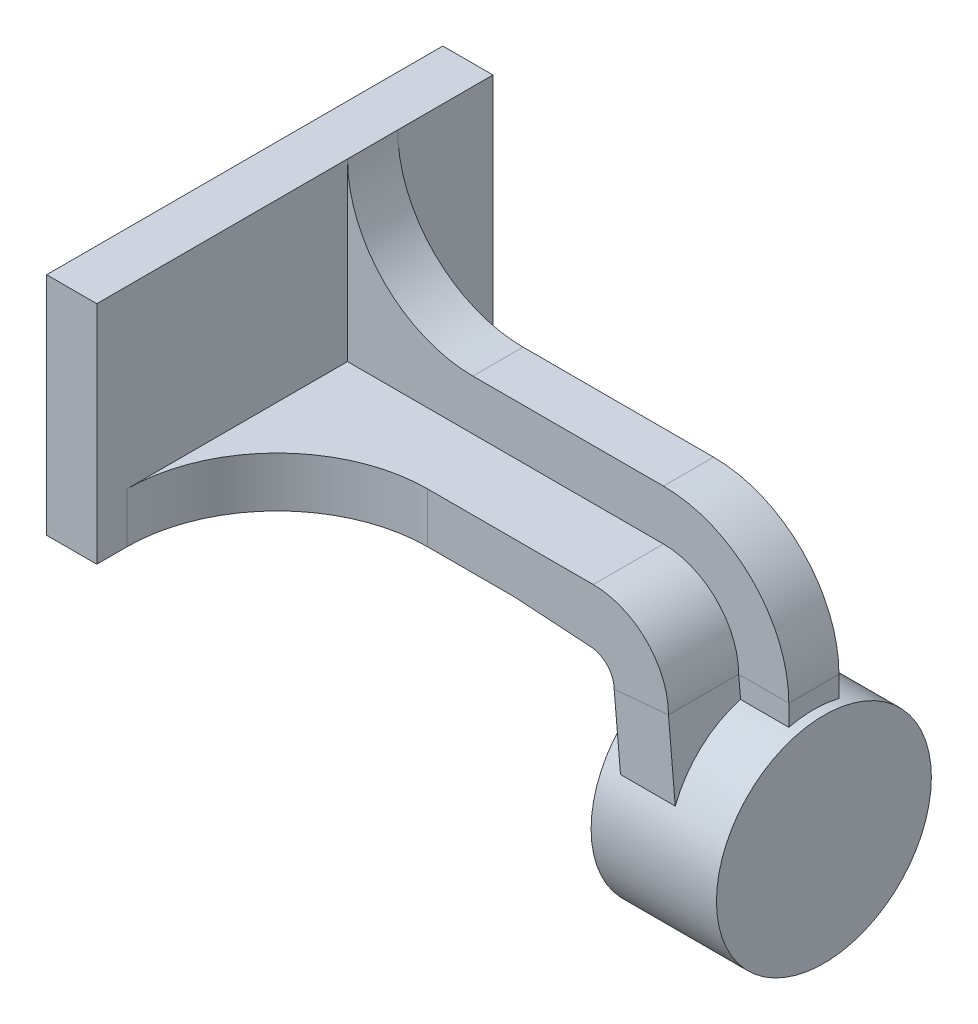
ISO-10303-21;
HEADER;
FILE_DESCRIPTION(('STEP AP214'),'2;1');
FILE_NAME('part.step','',(''),(''),'','','');
FILE_SCHEMA(('AUTOMOTIVE_DESIGN { 1 0 10303 214 1 1 1 1 }'));
ENDSEC;
DATA;
#1=APPLICATION_CONTEXT('core data for automotive mechanical design processes');
#2=APPLICATION_PROTOCOL_DEFINITION('international standard','automotive_design',2000,#1);
#3=PRODUCT_CONTEXT('',#1,'mechanical');
#4=PRODUCT('Part','Part','',(#3));
#5=PRODUCT_RELATED_PRODUCT_CATEGORY('part','',(#4));
#6=PRODUCT_DEFINITION_FORMATION('','',#4);
#7=PRODUCT_DEFINITION_CONTEXT('part definition',#1,'design');
#8=PRODUCT_DEFINITION('design','',#6,#7);
#9=PRODUCT_DEFINITION_SHAPE('','',#8);
#10=(LENGTH_UNIT() NAMED_UNIT(*) SI_UNIT(.MILLI.,.METRE.));
#11=(NAMED_UNIT(*) PLANE_ANGLE_UNIT() SI_UNIT($,.RADIAN.));
#12=(NAMED_UNIT(*) SI_UNIT($,.STERADIAN.) SOLID_ANGLE_UNIT());
#13=UNCERTAINTY_MEASURE_WITH_UNIT(LENGTH_MEASURE(1.E-05),#10,'distance_accuracy_value','');
#14=(GEOMETRIC_REPRESENTATION_CONTEXT(3) GLOBAL_UNCERTAINTY_ASSIGNED_CONTEXT((#13)) GLOBAL_UNIT_ASSIGNED_CONTEXT((#10,
#11,#12)) REPRESENTATION_CONTEXT('',''));
#15=CARTESIAN_POINT('',(0.,0.,0.));
#16=DIRECTION('',(0.,0.,1.));
#17=DIRECTION('',(1.,0.,0.));
#18=AXIS2_PLACEMENT_3D('',#15,#16,#17);
#19=CARTESIAN_POINT('',(75.,-34.9279807418266,25.1112766748221));
#20=DIRECTION('',(1.,0.,0.));
#21=DIRECTION('',(0.,0.,-1.));
#22=AXIS2_PLACEMENT_3D('',#19,#20,#21);
#23=CYLINDRICAL_SURFACE('',#22,21.4279991516626);
#24=CARTESIAN_POINT('',(75.,-34.9279807418266,25.1112766748221));
#25=DIRECTION('',(1.,0.,0.));
#26=DIRECTION('',(0.,0.,-1.));
#27=AXIS2_PLACEMENT_3D('',#24,#25,#26);
#28=CIRCLE('',#27,21.4279991516626);
#29=CARTESIAN_POINT('',(75.,-34.9279807418266,3.68327752315946));
#30=VERTEX_POINT('',#29);
#31=EDGE_CURVE('E164',#30,#30,#28,.T.);
#32=ORIENTED_EDGE('',*,*,#31,.T.);
#33=EDGE_LOOP('',(#32));
#34=FACE_BOUND('',#33,.T.);
#35=CARTESIAN_POINT('',(100.,-34.9279807418266,25.1112766748221));
#36=DIRECTION('',(1.,0.,0.));
#37=DIRECTION('',(0.,0.,-1.));
#38=AXIS2_PLACEMENT_3D('',#35,#36,#37);
#39=CIRCLE('',#38,21.4279991516626);
#40=CARTESIAN_POINT('',(100.,-34.9279807418266,3.68327752315946));
#41=VERTEX_POINT('',#40);
#42=EDGE_CURVE('E163',#41,#41,#39,.T.);
#43=ORIENTED_EDGE('',*,*,#42,.F.);
#44=EDGE_LOOP('',(#43));
#45=FACE_BOUND('',#44,.T.);
#46=CARTESIAN_POINT('',(79.3245673172224,-34.9279807418266,25.1112766748221));
#47=DIRECTION('',(0.996013829020688,0.08919894842176,0.));
#48=DIRECTION('',(0.08919894842176,-0.996013829020688,0.));
#49=AXIS2_PLACEMENT_3D('',#46,#47,#48);
#50=ELLIPSE('',#49,21.5137566641332,21.4279991516626);
#51=CARTESIAN_POINT('',(78.4372892313713,-25.0204508961156,44.1112766748221));
#52=VERTEX_POINT('',#51);
#53=CARTESIAN_POINT('',(77.4585363613101,-14.0914947702513,30.1112766748221));
#54=VERTEX_POINT('',#53);
#55=EDGE_CURVE('E12',#52,#54,#50,.F.);
#56=ORIENTED_EDGE('',*,*,#55,.T.);
#57=DIRECTION('',(1.,0.,0.));
#58=VECTOR('',#57,1.);
#59=CARTESIAN_POINT('',(75.,-14.0914947702513,30.1112766748221));
#60=LINE('',#59,#58);
#61=CARTESIAN_POINT('',(88.,-14.0914947702513,30.1112766748221));
#62=VERTEX_POINT('',#61);
#63=EDGE_CURVE('E112',#54,#62,#60,.T.);
#64=ORIENTED_EDGE('',*,*,#63,.T.);
#65=CARTESIAN_POINT('',(88.,-34.9279807418266,25.1112766748221));
#66=DIRECTION('',(1.,0.,0.));
#67=DIRECTION('',(0.,1.,0.));
#68=AXIS2_PLACEMENT_3D('',#65,#66,#67);
#69=CIRCLE('',#68,21.4279991516626);
#70=CARTESIAN_POINT('',(88.,-14.0914947702513,20.1112766748221));
#71=VERTEX_POINT('',#70);
#72=EDGE_CURVE('E178',#62,#71,#69,.F.);
#73=ORIENTED_EDGE('',*,*,#72,.T.);
#74=DIRECTION('',(1.,0.,0.));
#75=VECTOR('',#74,1.);
#76=CARTESIAN_POINT('',(75.,-14.0914947702513,20.1112766748221));
#77=LINE('',#76,#75);
#78=CARTESIAN_POINT('',(98.,-14.0914947702513,20.1112766748221));
#79=VERTEX_POINT('',#78);
#80=EDGE_CURVE('E175',#71,#79,#77,.T.);
#81=ORIENTED_EDGE('',*,*,#80,.T.);
#82=CARTESIAN_POINT('',(98.,-34.9279807418266,25.1112766748221));
#83=DIRECTION('',(-1.,0.,0.));
#84=DIRECTION('',(0.,-1.,0.));
#85=AXIS2_PLACEMENT_3D('',#82,#83,#84);
#86=CIRCLE('',#85,21.4279991516626);
#87=CARTESIAN_POINT('',(98.,-14.0914947702513,30.1112766748221));
#88=VERTEX_POINT('',#87);
#89=EDGE_CURVE('E172',#79,#88,#86,.F.);
#90=ORIENTED_EDGE('',*,*,#89,.T.);
#91=DIRECTION('',(1.,0.,0.));
#92=VECTOR('',#91,1.);
#93=CARTESIAN_POINT('',(75.,-14.0914947702513,30.1112766748221));
#94=LINE('',#93,#92);
#95=CARTESIAN_POINT('',(88.3728673862289,-14.0914947702513,30.1112766748221));
#96=VERTEX_POINT('',#95);
#97=EDGE_CURVE('E167',#88,#96,#94,.F.);
#98=ORIENTED_EDGE('',*,*,#97,.T.);
#99=CARTESIAN_POINT('',(90.2388983421411,-34.9279807418266,25.1112766748221));
#100=DIRECTION('',(-0.996013829020688,-0.08919894842176,0.));
#101=DIRECTION('',(0.08919894842176,-0.996013829020688,0.));
#102=AXIS2_PLACEMENT_3D('',#99,#100,#101);
#103=ELLIPSE('',#102,21.5137566641332,21.4279991516626);
#104=CARTESIAN_POINT('',(89.3516202562901,-25.0204508961156,44.1112766748221));
#105=VERTEX_POINT('',#104);
#106=EDGE_CURVE('E140',#96,#105,#103,.F.);
#107=ORIENTED_EDGE('',*,*,#106,.T.);
#108=DIRECTION('',(1.,0.,0.));
#109=VECTOR('',#108,1.);
#110=CARTESIAN_POINT('',(75.,-25.0204508961156,44.1112766748221));
#111=LINE('',#110,#109);
#112=EDGE_CURVE('E57',#105,#52,#111,.F.);
#113=ORIENTED_EDGE('',*,*,#112,.T.);
#114=EDGE_LOOP('',(#56,#64,#73,#81,#90,#98,#107,#113));
#115=FACE_BOUND('',#114,.T.);
#116=ADVANCED_FACE('F49',(#34,#45,#115),#23,.T.);
#117=CARTESIAN_POINT('',(88.,-20.9279807418266,30.1112766748221));
#118=DIRECTION('',(0.,0.,-1.));
#119=DIRECTION('',(-1.,0.,0.));
#120=AXIS2_PLACEMENT_3D('',#117,#118,#119);
#121=PLANE('',#120);
#122=DIRECTION('',(-0.08919894842176,0.996013829020688,0.));
#123=VECTOR('',#122,1.);
#124=CARTESIAN_POINT('',(90.5867695042311,-38.8123817834266,30.1112766748221));
#125=LINE('',#124,#123);
#126=CARTESIAN_POINT('',(88.,-9.92798074182661,30.1112766748221));
#127=VERTEX_POINT('',#126);
#128=EDGE_CURVE('E115',#96,#127,#125,.T.);
#129=ORIENTED_EDGE('',*,*,#128,.F.);
#130=ORIENTED_EDGE('',*,*,#97,.F.);
#131=DIRECTION('',(0.,1.,0.));
#132=VECTOR('',#131,1.);
#133=CARTESIAN_POINT('',(98.,-20.9279807418266,30.1112766748221));
#134=LINE('',#133,#132);
#135=CARTESIAN_POINT('',(98.,-9.9279807418266,30.1112766748221));
#136=VERTEX_POINT('',#135);
#137=EDGE_CURVE('E157',#88,#136,#134,.T.);
#138=ORIENTED_EDGE('',*,*,#137,.T.);
#139=DIRECTION('',(-1.,0.,0.));
#140=VECTOR('',#139,1.);
#141=CARTESIAN_POINT('',(88.,-9.92798074182661,30.1112766748221));
#142=LINE('',#141,#140);
#143=EDGE_CURVE('E151',#136,#127,#142,.T.);
#144=ORIENTED_EDGE('',*,*,#143,.T.);
#145=EDGE_LOOP('',(#129,#130,#138,#144));
#146=FACE_BOUND('',#145,.T.);
#147=ADVANCED_FACE('F211',(#146),#121,.F.);
#148=CARTESIAN_POINT('',(75.,-34.9279807418266,25.1112766748221));
#149=DIRECTION('',(1.,0.,0.));
#150=DIRECTION('',(0.,0.,-1.));
#151=AXIS2_PLACEMENT_3D('',#148,#149,#150);
#152=PLANE('',#151);
#153=ORIENTED_EDGE('',*,*,#31,.F.);
#154=EDGE_LOOP('',(#153));
#155=FACE_BOUND('',#154,.T.);
#156=ADVANCED_FACE('F51',(#155),#152,.F.);
#157=CARTESIAN_POINT('',(100.,-34.9279807418266,25.1112766748221));
#158=DIRECTION('',(1.,0.,0.));
#159=DIRECTION('',(0.,0.,-1.));
#160=AXIS2_PLACEMENT_3D('',#157,#158,#159);
#161=PLANE('',#160);
#162=ORIENTED_EDGE('',*,*,#42,.T.);
#163=EDGE_LOOP('',(#162));
#164=FACE_BOUND('',#163,.T.);
#165=ADVANCED_FACE('F221',(#164),#161,.T.);
#166=CARTESIAN_POINT('',(88.,-20.9279807418266,20.1112766748221));
#167=DIRECTION('',(1.,0.,0.));
#168=DIRECTION('',(0.,1.,0.));
#169=AXIS2_PLACEMENT_3D('',#166,#167,#168);
#170=PLANE('',#169);
#171=ORIENTED_EDGE('',*,*,#72,.F.);
#172=DIRECTION('',(0.,1.,0.));
#173=VECTOR('',#172,1.);
#174=CARTESIAN_POINT('',(88.,-20.9279807418266,30.1112766748221));
#175=LINE('',#174,#173);
#176=EDGE_CURVE('E154',#62,#127,#175,.T.);
#177=ORIENTED_EDGE('',*,*,#176,.T.);
#178=DIRECTION('',(0.,0.,-1.));
#179=VECTOR('',#178,1.);
#180=CARTESIAN_POINT('',(88.,-9.92798074182661,20.1112766748221));
#181=LINE('',#180,#179);
#182=CARTESIAN_POINT('',(88.,-9.92798074182661,20.1112766748221));
#183=VERTEX_POINT('',#182);
#184=EDGE_CURVE('E142',#127,#183,#181,.T.);
#185=ORIENTED_EDGE('',*,*,#184,.T.);
#186=DIRECTION('',(0.,1.,0.));
#187=VECTOR('',#186,1.);
#188=CARTESIAN_POINT('',(88.,-20.9279807418266,20.1112766748221));
#189=LINE('',#188,#187);
#190=EDGE_CURVE('E161',#71,#183,#189,.T.);
#191=ORIENTED_EDGE('',*,*,#190,.F.);
#192=EDGE_LOOP('',(#171,#177,#185,#191));
#193=FACE_BOUND('',#192,.T.);
#194=ADVANCED_FACE('F183',(#193),#170,.F.);
#195=CARTESIAN_POINT('',(98.,-20.9279807418266,20.1112766748221));
#196=DIRECTION('',(0.,0.,1.));
#197=DIRECTION('',(1.,0.,0.));
#198=AXIS2_PLACEMENT_3D('',#195,#196,#197);
#199=PLANE('',#198);
#200=ORIENTED_EDGE('',*,*,#80,.F.);
#201=ORIENTED_EDGE('',*,*,#190,.T.);
#202=DIRECTION('',(1.,0.,0.));
#203=VECTOR('',#202,1.);
#204=CARTESIAN_POINT('',(98.,-9.9279807418266,20.1112766748221));
#205=LINE('',#204,#203);
#206=CARTESIAN_POINT('',(98.,-9.9279807418266,20.1112766748221));
#207=VERTEX_POINT('',#206);
#208=EDGE_CURVE('E145',#183,#207,#205,.T.);
#209=ORIENTED_EDGE('',*,*,#208,.T.);
#210=DIRECTION('',(0.,1.,0.));
#211=VECTOR('',#210,1.);
#212=CARTESIAN_POINT('',(98.,-20.9279807418266,20.1112766748221));
#213=LINE('',#212,#211);
#214=EDGE_CURVE('E159',#79,#207,#213,.T.);
#215=ORIENTED_EDGE('',*,*,#214,.F.);
#216=EDGE_LOOP('',(#200,#201,#209,#215));
#217=FACE_BOUND('',#216,.T.);
#218=ADVANCED_FACE('F186',(#217),#199,.F.);
#219=CARTESIAN_POINT('',(98.,-20.9279807418266,30.1112766748221));
#220=DIRECTION('',(-1.,0.,0.));
#221=DIRECTION('',(0.,-1.,0.));
#222=AXIS2_PLACEMENT_3D('',#219,#220,#221);
#223=PLANE('',#222);
#224=ORIENTED_EDGE('',*,*,#89,.F.);
#225=ORIENTED_EDGE('',*,*,#214,.T.);
#226=DIRECTION('',(0.,0.,1.));
#227=VECTOR('',#226,1.);
#228=CARTESIAN_POINT('',(98.,-9.9279807418266,30.1112766748221));
#229=LINE('',#228,#227);
#230=EDGE_CURVE('E148',#207,#136,#229,.T.);
#231=ORIENTED_EDGE('',*,*,#230,.T.);
#232=ORIENTED_EDGE('',*,*,#137,.F.);
#233=EDGE_LOOP('',(#224,#225,#231,#232));
#234=FACE_BOUND('',#233,.T.);
#235=ADVANCED_FACE('F194',(#234),#223,.F.);
#236=CARTESIAN_POINT('',(0.,-9.92798074182662,0.));
#237=DIRECTION('',(0.,1.,0.));
#238=DIRECTION('',(-1.,0.,0.));
#239=AXIS2_PLACEMENT_3D('',#236,#237,#238);
#240=PLANE('',#239);
#241=ORIENTED_EDGE('',*,*,#184,.F.);
#242=ORIENTED_EDGE('',*,*,#143,.F.);
#243=ORIENTED_EDGE('',*,*,#230,.F.);
#244=ORIENTED_EDGE('',*,*,#208,.F.);
#245=EDGE_LOOP('',(#241,#242,#243,#244));
#246=FACE_BOUND('',#245,.T.);
#247=ADVANCED_FACE('F190',(#246),#240,.T.);
#248=CARTESIAN_POINT('',(79.759277834585,-39.7820479093753,30.1112766748221));
#249=DIRECTION('',(0.,0.,1.));
#250=DIRECTION('',(1.,0.,0.));
#251=AXIS2_PLACEMENT_3D('',#248,#249,#250);
#252=PLANE('',#251);
#253=ORIENTED_EDGE('',*,*,#63,.F.);
#254=DIRECTION('',(-0.08919894842176,0.996013829020688,0.));
#255=VECTOR('',#254,1.);
#256=CARTESIAN_POINT('',(79.759277834585,-39.7820479093753,30.1112766748221));
#257=LINE('',#256,#255);
#258=CARTESIAN_POINT('',(77.1725083303539,-10.8976468677753,30.1112766748221));
#259=VERTEX_POINT('',#258);
#260=EDGE_CURVE('E106',#54,#259,#257,.T.);
#261=ORIENTED_EDGE('',*,*,#260,.T.);
#262=DIRECTION('',(0.996013829020688,0.0891989484217602,0.));
#263=VECTOR('',#262,1.);
#264=CARTESIAN_POINT('',(77.1725083303539,-10.8976468677753,30.1112766748221));
#265=LINE('',#264,#263);
#266=EDGE_CURVE('E110',#259,#127,#265,.T.);
#267=ORIENTED_EDGE('',*,*,#266,.T.);
#268=ORIENTED_EDGE('',*,*,#176,.F.);
#269=EDGE_LOOP('',(#253,#261,#267,#268));
#270=FACE_BOUND('',#269,.T.);
#271=ADVANCED_FACE('F108',(#270),#252,.F.);
#272=CARTESIAN_POINT('',(79.759277834585,-39.7820479093753,44.1112766748221));
#273=DIRECTION('',(0.996013829020688,0.08919894842176,0.));
#274=DIRECTION('',(-0.08919894842176,0.996013829020688,0.));
#275=AXIS2_PLACEMENT_3D('',#272,#273,#274);
#276=PLANE('',#275);
#277=ORIENTED_EDGE('',*,*,#55,.F.);
#278=DIRECTION('',(-0.08919894842176,0.996013829020688,0.));
#279=VECTOR('',#278,1.);
#280=CARTESIAN_POINT('',(79.759277834585,-39.7820479093753,44.1112766748221));
#281=LINE('',#280,#279);
#282=CARTESIAN_POINT('',(77.1725083303539,-10.8976468677753,44.1112766748221));
#283=VERTEX_POINT('',#282);
#284=EDGE_CURVE('E127',#52,#283,#281,.T.);
#285=ORIENTED_EDGE('',*,*,#284,.T.);
#286=DIRECTION('',(0.,0.,-1.));
#287=VECTOR('',#286,1.);
#288=CARTESIAN_POINT('',(77.1725083303539,-10.8976468677753,44.1112766748221));
#289=LINE('',#288,#287);
#290=EDGE_CURVE('E121',#283,#259,#289,.T.);
#291=ORIENTED_EDGE('',*,*,#290,.T.);
#292=ORIENTED_EDGE('',*,*,#260,.F.);
#293=EDGE_LOOP('',(#277,#285,#291,#292));
#294=FACE_BOUND('',#293,.T.);
#295=ADVANCED_FACE('F125',(#294),#276,.F.);
#296=CARTESIAN_POINT('',(90.5867695042311,-38.8123817834266,44.1112766748221));
#297=DIRECTION('',(-0.996013829020688,-0.08919894842176,0.));
#298=DIRECTION('',(0.08919894842176,-0.996013829020688,0.));
#299=AXIS2_PLACEMENT_3D('',#296,#297,#298);
#300=PLANE('',#299);
#301=ORIENTED_EDGE('',*,*,#106,.F.);
#302=ORIENTED_EDGE('',*,*,#128,.T.);
#303=DIRECTION('',(0.,0.,1.));
#304=VECTOR('',#303,1.);
#305=CARTESIAN_POINT('',(88.,-9.92798074182661,44.1112766748221));
#306=LINE('',#305,#304);
#307=CARTESIAN_POINT('',(88.,-9.92798074182661,44.1112766748221));
#308=VERTEX_POINT('',#307);
#309=EDGE_CURVE('E123',#127,#308,#306,.T.);
#310=ORIENTED_EDGE('',*,*,#309,.T.);
#311=DIRECTION('',(-0.08919894842176,0.996013829020688,0.));
#312=VECTOR('',#311,1.);
#313=CARTESIAN_POINT('',(90.5867695042311,-38.8123817834266,44.1112766748221));
#314=LINE('',#313,#312);
#315=EDGE_CURVE('E135',#105,#308,#314,.T.);
#316=ORIENTED_EDGE('',*,*,#315,.F.);
#317=EDGE_LOOP('',(#301,#302,#310,#316));
#318=FACE_BOUND('',#317,.T.);
#319=ADVANCED_FACE('F199',(#318),#300,.F.);
#320=CARTESIAN_POINT('',(79.759277834585,-39.7820479093753,44.1112766748221));
#321=DIRECTION('',(0.,0.,-1.));
#322=DIRECTION('',(-1.,0.,0.));
#323=AXIS2_PLACEMENT_3D('',#320,#321,#322);
#324=PLANE('',#323);
#325=ORIENTED_EDGE('',*,*,#112,.F.);
#326=ORIENTED_EDGE('',*,*,#315,.T.);
#327=DIRECTION('',(-0.996013829020688,-0.0891989484217602,0.));
#328=VECTOR('',#327,1.);
#329=CARTESIAN_POINT('',(77.1725083303539,-10.8976468677753,44.1112766748221));
#330=LINE('',#329,#328);
#331=EDGE_CURVE('E132',#308,#283,#330,.T.);
#332=ORIENTED_EDGE('',*,*,#331,.T.);
#333=ORIENTED_EDGE('',*,*,#284,.F.);
#334=EDGE_LOOP('',(#325,#326,#332,#333));
#335=FACE_BOUND('',#334,.T.);
#336=ADVANCED_FACE('F201',(#335),#324,.F.);
#337=CARTESIAN_POINT('',(1.58220323801696,-17.6672072179022,0.));
#338=DIRECTION('',(0.0891989484217602,-0.996013829020688,0.));
#339=DIRECTION('',(0.996013829020688,0.0891989484217602,0.));
#340=AXIS2_PLACEMENT_3D('',#337,#338,#339);
#341=PLANE('',#340);
#342=ORIENTED_EDGE('',*,*,#290,.F.);
#343=ORIENTED_EDGE('',*,*,#331,.F.);
#344=ORIENTED_EDGE('',*,*,#309,.F.);
#345=ORIENTED_EDGE('',*,*,#266,.F.);
#346=EDGE_LOOP('',(#342,#343,#344,#345));
#347=FACE_BOUND('',#346,.T.);
#348=ADVANCED_FACE('F119',(#347),#341,.F.);
#349=CLOSED_SHELL('',(#116,#147,#156,#165,#194,#218,#235,#247,#271,#295,#319,#336,#348));
#350=MANIFOLD_SOLID_BREP('B2',#349);
#351=CARTESIAN_POINT('',(10.,-4.92798074182661,0.));
#352=DIRECTION('',(-1.,0.,0.));
#353=DIRECTION('',(0.,0.,1.));
#354=AXIS2_PLACEMENT_3D('',#351,#352,#353);
#355=PLANE('',#354);
#356=DIRECTION('',(0.,0.,1.));
#357=VECTOR('',#356,1.);
#358=CARTESIAN_POINT('',(10.,5.0720192581734,0.));
#359=LINE('',#358,#357);
#360=CARTESIAN_POINT('',(10.,5.0720192581734,30.1112766748221));
#361=VERTEX_POINT('',#360);
#362=CARTESIAN_POINT('',(10.,5.0720192581734,74.1112766748223));
#363=VERTEX_POINT('',#362);
#364=EDGE_CURVE('E433',#361,#363,#359,.T.);
#365=ORIENTED_EDGE('',*,*,#364,.F.);
#366=DIRECTION('',(0.,1.,0.));
#367=VECTOR('',#366,1.);
#368=CARTESIAN_POINT('',(10.,-4.92798074182661,30.1112766748221));
#369=LINE('',#368,#367);
#370=CARTESIAN_POINT('',(10.,-4.92798074182661,30.1112766748221));
#371=VERTEX_POINT('',#370);
#372=EDGE_CURVE('E47',#371,#361,#369,.T.);
#373=ORIENTED_EDGE('',*,*,#372,.F.);
#374=DIRECTION('',(0.,0.,1.));
#375=VECTOR('',#374,1.);
#376=CARTESIAN_POINT('',(10.,-4.92798074182661,0.));
#377=LINE('',#376,#375);
#378=CARTESIAN_POINT('',(10.,-4.92798074182661,74.1112766748223));
#379=VERTEX_POINT('',#378);
#380=EDGE_CURVE('E434',#371,#379,#377,.T.);
#381=ORIENTED_EDGE('',*,*,#380,.T.);
#382=DIRECTION('',(0.,1.,0.));
#383=VECTOR('',#382,1.);
#384=CARTESIAN_POINT('',(10.,-4.92798074182661,74.1112766748223));
#385=LINE('',#384,#383);
#386=EDGE_CURVE('E332',#379,#363,#385,.T.);
#387=ORIENTED_EDGE('',*,*,#386,.T.);
#388=EDGE_LOOP('',(#365,#373,#381,#387));
#389=FACE_BOUND('',#388,.T.);
#390=ADVANCED_FACE('F329',(#389),#355,.T.);
#391=CARTESIAN_POINT('',(0.,-4.92798074182661,30.1112766748221));
#392=DIRECTION('',(0.,0.,1.));
#393=DIRECTION('',(1.,0.,0.));
#394=AXIS2_PLACEMENT_3D('',#391,#392,#393);
#395=PLANE('',#394);
#396=DIRECTION('',(1.,0.,0.));
#397=VECTOR('',#396,1.);
#398=CARTESIAN_POINT('',(0.,5.0720192581734,30.1112766748221));
#399=LINE('',#398,#397);
#400=CARTESIAN_POINT('',(73.,5.07201925817339,30.1112766748221));
#401=VERTEX_POINT('',#400);
#402=EDGE_CURVE('E436',#361,#401,#399,.T.);
#403=ORIENTED_EDGE('',*,*,#402,.T.);
#404=CARTESIAN_POINT('',(73.,-9.92798074182661,30.1112766748221));
#405=DIRECTION('',(0.,0.,1.));
#406=DIRECTION('',(1.,0.,0.));
#407=AXIS2_PLACEMENT_3D('',#404,#405,#406);
#408=CIRCLE('',#407,15.);
#409=CARTESIAN_POINT('',(88.,-9.92798074182661,30.1112766748221));
#410=VERTEX_POINT('',#409);
#411=EDGE_CURVE('E403',#410,#401,#408,.T.);
#412=ORIENTED_EDGE('',*,*,#411,.F.);
#413=DIRECTION('',(0.996013829020688,0.08919894842176,0.));
#414=VECTOR('',#413,1.);
#415=CARTESIAN_POINT('',(88.,-9.92798074182661,30.1112766748221));
#416=LINE('',#415,#414);
#417=CARTESIAN_POINT('',(77.1725083303539,-10.8976468677753,30.1112766748221));
#418=VERTEX_POINT('',#417);
#419=EDGE_CURVE('E408',#418,#410,#416,.T.);
#420=ORIENTED_EDGE('',*,*,#419,.F.);
#421=CARTESIAN_POINT('',(72.1725083303539,-10.8976468677753,30.1112766748221));
#422=DIRECTION('',(0.,0.,-1.));
#423=DIRECTION('',(1.,0.,0.));
#424=AXIS2_PLACEMENT_3D('',#421,#422,#423);
#425=CIRCLE('',#424,5.);
#426=CARTESIAN_POINT('',(72.1725083303539,-5.89764686777527,30.1112766748221));
#427=VERTEX_POINT('',#426);
#428=EDGE_CURVE('E419',#427,#418,#425,.T.);
#429=ORIENTED_EDGE('',*,*,#428,.F.);
#430=DIRECTION('',(0.997863076150816,-0.0653397371806042,0.));
#431=VECTOR('',#430,1.);
#432=CARTESIAN_POINT('',(57.36384724554,-4.92798074182661,30.1112766748221));
#433=LINE('',#432,#431);
#434=CARTESIAN_POINT('',(57.36384724554,-4.92798074182661,30.1112766748221));
#435=VERTEX_POINT('',#434);
#436=EDGE_CURVE('E417',#435,#427,#433,.T.);
#437=ORIENTED_EDGE('',*,*,#436,.F.);
#438=DIRECTION('',(1.,0.,0.));
#439=VECTOR('',#438,1.);
#440=CARTESIAN_POINT('',(0.,-4.92798074182661,30.1112766748221));
#441=LINE('',#440,#439);
#442=EDGE_CURVE('E383',#371,#435,#441,.T.);
#443=ORIENTED_EDGE('',*,*,#442,.F.);
#444=ORIENTED_EDGE('',*,*,#372,.T.);
#445=EDGE_LOOP('',(#403,#412,#420,#429,#437,#443,#444));
#446=FACE_BOUND('',#445,.T.);
#447=ADVANCED_FACE('F452',(#446),#395,.F.);
#448=CARTESIAN_POINT('',(0.,-4.92798074182661,44.1112766748221));
#449=DIRECTION('',(0.,0.,-1.));
#450=DIRECTION('',(-1.,0.,0.));
#451=AXIS2_PLACEMENT_3D('',#448,#449,#450);
#452=PLANE('',#451);
#453=DIRECTION('',(-1.,0.,0.));
#454=VECTOR('',#453,1.);
#455=CARTESIAN_POINT('',(0.,5.0720192581734,44.1112766748221));
#456=LINE('',#455,#454);
#457=CARTESIAN_POINT('',(73.,5.07201925817339,44.1112766748221));
#458=VERTEX_POINT('',#457);
#459=CARTESIAN_POINT('',(40.0000000000002,5.0720192581734,44.1112766748221));
#460=VERTEX_POINT('',#459);
#461=EDGE_CURVE('E444',#458,#460,#456,.T.);
#462=ORIENTED_EDGE('',*,*,#461,.T.);
#463=DIRECTION('',(0.,1.,0.));
#464=VECTOR('',#463,1.);
#465=CARTESIAN_POINT('',(40.0000000000002,-4.92798074182661,44.1112766748221));
#466=LINE('',#465,#464);
#467=CARTESIAN_POINT('',(40.0000000000002,-4.92798074182661,44.1112766748221));
#468=VERTEX_POINT('',#467);
#469=EDGE_CURVE('E338',#468,#460,#466,.T.);
#470=ORIENTED_EDGE('',*,*,#469,.F.);
#471=DIRECTION('',(-1.,0.,0.));
#472=VECTOR('',#471,1.);
#473=CARTESIAN_POINT('',(0.,-4.92798074182661,44.1112766748221));
#474=LINE('',#473,#472);
#475=CARTESIAN_POINT('',(57.36384724554,-4.92798074182661,44.1112766748221));
#476=VERTEX_POINT('',#475);
#477=EDGE_CURVE('E382',#476,#468,#474,.T.);
#478=ORIENTED_EDGE('',*,*,#477,.F.);
#479=DIRECTION('',(0.997863076150816,-0.0653397371806042,0.));
#480=VECTOR('',#479,1.);
#481=CARTESIAN_POINT('',(57.36384724554,-4.92798074182661,44.1112766748221));
#482=LINE('',#481,#480);
#483=CARTESIAN_POINT('',(72.1725083303539,-5.89764686777527,44.1112766748221));
#484=VERTEX_POINT('',#483);
#485=EDGE_CURVE('E394',#476,#484,#482,.T.);
#486=ORIENTED_EDGE('',*,*,#485,.T.);
#487=CARTESIAN_POINT('',(72.1725083303539,-10.8976468677753,44.1112766748221));
#488=DIRECTION('',(0.,0.,-1.));
#489=DIRECTION('',(1.,0.,0.));
#490=AXIS2_PLACEMENT_3D('',#487,#488,#489);
#491=CIRCLE('',#490,5.);
#492=CARTESIAN_POINT('',(77.1725083303539,-10.8976468677753,44.1112766748221));
#493=VERTEX_POINT('',#492);
#494=EDGE_CURVE('E402',#484,#493,#491,.T.);
#495=ORIENTED_EDGE('',*,*,#494,.T.);
#496=DIRECTION('',(0.996013829020688,0.08919894842176,0.));
#497=VECTOR('',#496,1.);
#498=CARTESIAN_POINT('',(88.,-9.92798074182661,44.1112766748221));
#499=LINE('',#498,#497);
#500=CARTESIAN_POINT('',(88.,-9.92798074182661,44.1112766748221));
#501=VERTEX_POINT('',#500);
#502=EDGE_CURVE('E405',#493,#501,#499,.T.);
#503=ORIENTED_EDGE('',*,*,#502,.T.);
#504=CARTESIAN_POINT('',(73.,-9.92798074182661,44.1112766748221));
#505=DIRECTION('',(0.,0.,1.));
#506=DIRECTION('',(1.,0.,0.));
#507=AXIS2_PLACEMENT_3D('',#504,#505,#506);
#508=CIRCLE('',#507,15.);
#509=EDGE_CURVE('E413',#501,#458,#508,.T.);
#510=ORIENTED_EDGE('',*,*,#509,.T.);
#511=EDGE_LOOP('',(#462,#470,#478,#486,#495,#503,#510));
#512=FACE_BOUND('',#511,.T.);
#513=ADVANCED_FACE('F391',(#512),#452,.F.);
#514=CARTESIAN_POINT('',(40.,-4.92798074182661,74.1112766748221));
#515=DIRECTION('',(0.,1.,0.));
#516=DIRECTION('',(0.,0.,1.));
#517=AXIS2_PLACEMENT_3D('',#514,#515,#516);
#518=CYLINDRICAL_SURFACE('',#517,30.);
#519=CARTESIAN_POINT('',(40.,5.0720192581734,74.1112766748221));
#520=DIRECTION('',(0.,1.,0.));
#521=DIRECTION('',(0.,0.,1.));
#522=AXIS2_PLACEMENT_3D('',#519,#520,#521);
#523=CIRCLE('',#522,30.);
#524=EDGE_CURVE('E441',#363,#460,#523,.F.);
#525=ORIENTED_EDGE('',*,*,#524,.F.);
#526=ORIENTED_EDGE('',*,*,#386,.F.);
#527=CARTESIAN_POINT('',(40.,-4.92798074182661,74.1112766748221));
#528=DIRECTION('',(0.,1.,0.));
#529=DIRECTION('',(0.,0.,1.));
#530=AXIS2_PLACEMENT_3D('',#527,#528,#529);
#531=CIRCLE('',#530,30.);
#532=EDGE_CURVE('E396',#379,#468,#531,.F.);
#533=ORIENTED_EDGE('',*,*,#532,.T.);
#534=ORIENTED_EDGE('',*,*,#469,.T.);
#535=EDGE_LOOP('',(#525,#526,#533,#534));
#536=FACE_BOUND('',#535,.T.);
#537=ADVANCED_FACE('F446',(#536),#518,.F.);
#538=CARTESIAN_POINT('',(0.,-4.92798074182661,0.));
#539=DIRECTION('',(0.,1.,0.));
#540=DIRECTION('',(0.,0.,1.));
#541=AXIS2_PLACEMENT_3D('',#538,#539,#540);
#542=PLANE('',#541);
#543=ORIENTED_EDGE('',*,*,#380,.F.);
#544=ORIENTED_EDGE('',*,*,#442,.T.);
#545=DIRECTION('',(0.,0.,1.));
#546=VECTOR('',#545,1.);
#547=CARTESIAN_POINT('',(57.36384724554,-4.92798074182661,0.));
#548=LINE('',#547,#546);
#549=EDGE_CURVE('E378',#435,#476,#548,.T.);
#550=ORIENTED_EDGE('',*,*,#549,.T.);
#551=ORIENTED_EDGE('',*,*,#477,.T.);
#552=ORIENTED_EDGE('',*,*,#532,.F.);
#553=EDGE_LOOP('',(#543,#544,#550,#551,#552));
#554=FACE_BOUND('',#553,.T.);
#555=ADVANCED_FACE('F381',(#554),#542,.F.);
#556=CARTESIAN_POINT('',(0.,5.0720192581734,0.));
#557=DIRECTION('',(0.,1.,0.));
#558=DIRECTION('',(0.,0.,1.));
#559=AXIS2_PLACEMENT_3D('',#556,#557,#558);
#560=PLANE('',#559);
#561=ORIENTED_EDGE('',*,*,#364,.T.);
#562=ORIENTED_EDGE('',*,*,#524,.T.);
#563=ORIENTED_EDGE('',*,*,#461,.F.);
#564=DIRECTION('',(0.,0.,-1.));
#565=VECTOR('',#564,1.);
#566=CARTESIAN_POINT('',(73.,5.07201925817339,44.1112766748221));
#567=LINE('',#566,#565);
#568=EDGE_CURVE('E416',#458,#401,#567,.T.);
#569=ORIENTED_EDGE('',*,*,#568,.T.);
#570=ORIENTED_EDGE('',*,*,#402,.F.);
#571=EDGE_LOOP('',(#561,#562,#563,#569,#570));
#572=FACE_BOUND('',#571,.T.);
#573=ADVANCED_FACE('F449',(#572),#560,.T.);
#574=CARTESIAN_POINT('',(57.36384724554,-4.92798074182661,44.1112766748221));
#575=DIRECTION('',(0.0653397371806042,0.997863076150816,0.));
#576=DIRECTION('',(-0.997863076150816,0.0653397371806042,0.));
#577=AXIS2_PLACEMENT_3D('',#574,#575,#576);
#578=PLANE('',#577);
#579=ORIENTED_EDGE('',*,*,#436,.T.);
#580=DIRECTION('',(0.,0.,-1.));
#581=VECTOR('',#580,1.);
#582=CARTESIAN_POINT('',(72.1725083303539,-5.89764686777527,44.1112766748221));
#583=LINE('',#582,#581);
#584=EDGE_CURVE('E400',#484,#427,#583,.T.);
#585=ORIENTED_EDGE('',*,*,#584,.F.);
#586=ORIENTED_EDGE('',*,*,#485,.F.);
#587=ORIENTED_EDGE('',*,*,#549,.F.);
#588=EDGE_LOOP('',(#579,#585,#586,#587));
#589=FACE_BOUND('',#588,.T.);
#590=ADVANCED_FACE('F398',(#589),#578,.F.);
#591=CARTESIAN_POINT('',(72.1725083303539,-10.8976468677753,44.1112766748221));
#592=DIRECTION('',(0.,0.,-1.));
#593=DIRECTION('',(-1.,0.,0.));
#594=AXIS2_PLACEMENT_3D('',#591,#592,#593);
#595=CYLINDRICAL_SURFACE('',#594,5.);
#596=ORIENTED_EDGE('',*,*,#428,.T.);
#597=DIRECTION('',(0.,0.,-1.));
#598=VECTOR('',#597,1.);
#599=CARTESIAN_POINT('',(77.1725083303539,-10.8976468677753,44.1112766748221));
#600=LINE('',#599,#598);
#601=EDGE_CURVE('E429',#493,#418,#600,.T.);
#602=ORIENTED_EDGE('',*,*,#601,.F.);
#603=ORIENTED_EDGE('',*,*,#494,.F.);
#604=ORIENTED_EDGE('',*,*,#584,.T.);
#605=EDGE_LOOP('',(#596,#602,#603,#604));
#606=FACE_BOUND('',#605,.T.);
#607=ADVANCED_FACE('F475',(#606),#595,.F.);
#608=CARTESIAN_POINT('',(88.,-9.92798074182661,44.1112766748221));
#609=DIRECTION('',(-0.08919894842176,0.996013829020688,0.));
#610=DIRECTION('',(-0.996013829020688,-0.08919894842176,0.));
#611=AXIS2_PLACEMENT_3D('',#608,#609,#610);
#612=PLANE('',#611);
#613=ORIENTED_EDGE('',*,*,#419,.T.);
#614=DIRECTION('',(0.,0.,-1.));
#615=VECTOR('',#614,1.);
#616=CARTESIAN_POINT('',(88.,-9.92798074182661,44.1112766748221));
#617=LINE('',#616,#615);
#618=EDGE_CURVE('E426',#501,#410,#617,.T.);
#619=ORIENTED_EDGE('',*,*,#618,.F.);
#620=ORIENTED_EDGE('',*,*,#502,.F.);
#621=ORIENTED_EDGE('',*,*,#601,.T.);
#622=EDGE_LOOP('',(#613,#619,#620,#621));
#623=FACE_BOUND('',#622,.T.);
#624=ADVANCED_FACE('F463',(#623),#612,.F.);
#625=CARTESIAN_POINT('',(73.,-9.92798074182661,44.1112766748221));
#626=DIRECTION('',(0.,0.,-1.));
#627=DIRECTION('',(-1.,0.,0.));
#628=AXIS2_PLACEMENT_3D('',#625,#626,#627);
#629=CYLINDRICAL_SURFACE('',#628,15.);
#630=ORIENTED_EDGE('',*,*,#411,.T.);
#631=ORIENTED_EDGE('',*,*,#568,.F.);
#632=ORIENTED_EDGE('',*,*,#509,.F.);
#633=ORIENTED_EDGE('',*,*,#618,.T.);
#634=EDGE_LOOP('',(#630,#631,#632,#633));
#635=FACE_BOUND('',#634,.T.);
#636=ADVANCED_FACE('F456',(#635),#629,.T.);
#637=CLOSED_SHELL('',(#390,#447,#513,#537,#555,#573,#590,#607,#624,#636));
#638=MANIFOLD_SOLID_BREP('B6',#637);
#639=CARTESIAN_POINT('',(10.,0.,0.));
#640=DIRECTION('',(1.,0.,0.));
#641=DIRECTION('',(0.,0.,-1.));
#642=AXIS2_PLACEMENT_3D('',#639,#640,#641);
#643=PLANE('',#642);
#644=DIRECTION('',(0.,0.,1.));
#645=VECTOR('',#644,1.);
#646=CARTESIAN_POINT('',(10.,40.0720192581734,80.1112766748221));
#647=LINE('',#646,#645);
#648=CARTESIAN_POINT('',(10.,40.0720192581734,1.1112766748221));
#649=VERTEX_POINT('',#648);
#650=CARTESIAN_POINT('',(10.,40.0720192581734,20.1112766748221));
#651=VERTEX_POINT('',#650);
#652=EDGE_CURVE('E719',#649,#651,#647,.T.);
#653=ORIENTED_EDGE('',*,*,#652,.T.);
#654=DIRECTION('',(0.,-1.,0.));
#655=VECTOR('',#654,1.);
#656=CARTESIAN_POINT('',(10.,0.,20.1112766748221));
#657=LINE('',#656,#655);
#658=CARTESIAN_POINT('',(10.,5.07201925817339,20.1112766748221));
#659=VERTEX_POINT('',#658);
#660=EDGE_CURVE('E580',#651,#659,#657,.T.);
#661=ORIENTED_EDGE('',*,*,#660,.T.);
#662=DIRECTION('',(0.,0.,1.));
#663=VECTOR('',#662,1.);
#664=CARTESIAN_POINT('',(10.,5.07201925817339,20.1112766748221));
#665=LINE('',#664,#663);
#666=CARTESIAN_POINT('',(10.,5.07201925817339,30.1112766748221));
#667=VERTEX_POINT('',#666);
#668=EDGE_CURVE('E699',#659,#667,#665,.T.);
#669=ORIENTED_EDGE('',*,*,#668,.T.);
#670=DIRECTION('',(0.,-1.,0.));
#671=VECTOR('',#670,1.);
#672=CARTESIAN_POINT('',(10.,0.,30.1112766748221));
#673=LINE('',#672,#671);
#674=CARTESIAN_POINT('',(10.,40.0720192581734,30.1112766748221));
#675=VERTEX_POINT('',#674);
#676=EDGE_CURVE('E586',#675,#667,#673,.T.);
#677=ORIENTED_EDGE('',*,*,#676,.F.);
#678=CARTESIAN_POINT('',(10.,40.0720192581734,80.1112766748221));
#679=VERTEX_POINT('',#678);
#680=EDGE_CURVE('E718',#675,#679,#647,.T.);
#681=ORIENTED_EDGE('',*,*,#680,.T.);
#682=DIRECTION('',(0.,-1.,0.));
#683=VECTOR('',#682,1.);
#684=CARTESIAN_POINT('',(10.,40.0720192581734,80.1112766748221));
#685=LINE('',#684,#683);
#686=CARTESIAN_POINT('',(10.,-4.9279807418266,80.1112766748221));
#687=VERTEX_POINT('',#686);
#688=EDGE_CURVE('E710',#679,#687,#685,.T.);
#689=ORIENTED_EDGE('',*,*,#688,.T.);
#690=DIRECTION('',(0.,0.,-1.));
#691=VECTOR('',#690,1.);
#692=CARTESIAN_POINT('',(10.,-4.9279807418266,80.1112766748221));
#693=LINE('',#692,#691);
#694=CARTESIAN_POINT('',(10.,-4.9279807418266,1.1112766748221));
#695=VERTEX_POINT('',#694);
#696=EDGE_CURVE('E713',#687,#695,#693,.T.);
#697=ORIENTED_EDGE('',*,*,#696,.T.);
#698=DIRECTION('',(0.,1.,0.));
#699=VECTOR('',#698,1.);
#700=CARTESIAN_POINT('',(10.,40.0720192581734,1.1112766748221));
#701=LINE('',#700,#699);
#702=EDGE_CURVE('E716',#695,#649,#701,.T.);
#703=ORIENTED_EDGE('',*,*,#702,.T.);
#704=EDGE_LOOP('',(#653,#661,#669,#677,#681,#689,#697,#703));
#705=FACE_BOUND('',#704,.T.);
#706=ADVANCED_FACE('F565',(#705),#643,.T.);
#707=CARTESIAN_POINT('',(10.,40.0720192581734,80.1112766748221));
#708=DIRECTION('',(0.,0.,-1.));
#709=DIRECTION('',(-1.,0.,0.));
#710=AXIS2_PLACEMENT_3D('',#707,#708,#709);
#711=PLANE('',#710);
#712=DIRECTION('',(0.,-1.,0.));
#713=VECTOR('',#712,1.);
#714=CARTESIAN_POINT('',(0.,40.0720192581734,80.1112766748221));
#715=LINE('',#714,#713);
#716=CARTESIAN_POINT('',(0.,40.0720192581734,80.1112766748221));
#717=VERTEX_POINT('',#716);
#718=CARTESIAN_POINT('',(0.,-4.9279807418266,80.1112766748221));
#719=VERTEX_POINT('',#718);
#720=EDGE_CURVE('E698',#717,#719,#715,.T.);
#721=ORIENTED_EDGE('',*,*,#720,.T.);
#722=DIRECTION('',(-1.,0.,0.));
#723=VECTOR('',#722,1.);
#724=CARTESIAN_POINT('',(10.,-4.9279807418266,80.1112766748221));
#725=LINE('',#724,#723);
#726=EDGE_CURVE('E327',#687,#719,#725,.T.);
#727=ORIENTED_EDGE('',*,*,#726,.F.);
#728=ORIENTED_EDGE('',*,*,#688,.F.);
#729=DIRECTION('',(-1.,0.,0.));
#730=VECTOR('',#729,1.);
#731=CARTESIAN_POINT('',(10.,40.0720192581734,80.1112766748221));
#732=LINE('',#731,#730);
#733=EDGE_CURVE('E721',#679,#717,#732,.T.);
#734=ORIENTED_EDGE('',*,*,#733,.T.);
#735=EDGE_LOOP('',(#721,#727,#728,#734));
#736=FACE_BOUND('',#735,.T.);
#737=ADVANCED_FACE('F567',(#736),#711,.F.);
#738=CARTESIAN_POINT('',(10.,-4.9279807418266,80.1112766748221));
#739=DIRECTION('',(0.,1.,0.));
#740=DIRECTION('',(0.,0.,1.));
#741=AXIS2_PLACEMENT_3D('',#738,#739,#740);
#742=PLANE('',#741);
#743=DIRECTION('',(0.,0.,-1.));
#744=VECTOR('',#743,1.);
#745=CARTESIAN_POINT('',(0.,-4.9279807418266,80.1112766748221));
#746=LINE('',#745,#744);
#747=CARTESIAN_POINT('',(0.,-4.9279807418266,1.1112766748221));
#748=VERTEX_POINT('',#747);
#749=EDGE_CURVE('E724',#719,#748,#746,.T.);
#750=ORIENTED_EDGE('',*,*,#749,.T.);
#751=DIRECTION('',(-1.,0.,0.));
#752=VECTOR('',#751,1.);
#753=CARTESIAN_POINT('',(10.,-4.9279807418266,1.1112766748221));
#754=LINE('',#753,#752);
#755=EDGE_CURVE('E573',#695,#748,#754,.T.);
#756=ORIENTED_EDGE('',*,*,#755,.F.);
#757=ORIENTED_EDGE('',*,*,#696,.F.);
#758=ORIENTED_EDGE('',*,*,#726,.T.);
#759=EDGE_LOOP('',(#750,#756,#757,#758));
#760=FACE_BOUND('',#759,.T.);
#761=ADVANCED_FACE('F783',(#760),#742,.F.);
#762=CARTESIAN_POINT('',(10.,40.0720192581734,1.1112766748221));
#763=DIRECTION('',(0.,0.,1.));
#764=DIRECTION('',(1.,0.,0.));
#765=AXIS2_PLACEMENT_3D('',#762,#763,#764);
#766=PLANE('',#765);
#767=DIRECTION('',(0.,1.,0.));
#768=VECTOR('',#767,1.);
#769=CARTESIAN_POINT('',(0.,40.0720192581734,1.1112766748221));
#770=LINE('',#769,#768);
#771=CARTESIAN_POINT('',(0.,40.0720192581734,1.1112766748221));
#772=VERTEX_POINT('',#771);
#773=EDGE_CURVE('E726',#748,#772,#770,.T.);
#774=ORIENTED_EDGE('',*,*,#773,.T.);
#775=DIRECTION('',(-1.,0.,0.));
#776=VECTOR('',#775,1.);
#777=CARTESIAN_POINT('',(10.,40.0720192581734,1.1112766748221));
#778=LINE('',#777,#776);
#779=EDGE_CURVE('E731',#649,#772,#778,.T.);
#780=ORIENTED_EDGE('',*,*,#779,.F.);
#781=ORIENTED_EDGE('',*,*,#702,.F.);
#782=ORIENTED_EDGE('',*,*,#755,.T.);
#783=EDGE_LOOP('',(#774,#780,#781,#782));
#784=FACE_BOUND('',#783,.T.);
#785=ADVANCED_FACE('F738',(#784),#766,.F.);
#786=CARTESIAN_POINT('',(10.,40.0720192581734,80.1112766748221));
#787=DIRECTION('',(0.,-1.,0.));
#788=DIRECTION('',(0.,0.,-1.));
#789=AXIS2_PLACEMENT_3D('',#786,#787,#788);
#790=PLANE('',#789);
#791=DIRECTION('',(0.,0.,1.));
#792=VECTOR('',#791,1.);
#793=CARTESIAN_POINT('',(0.,40.0720192581734,80.1112766748221));
#794=LINE('',#793,#792);
#795=EDGE_CURVE('E714',#772,#717,#794,.T.);
#796=ORIENTED_EDGE('',*,*,#795,.T.);
#797=ORIENTED_EDGE('',*,*,#733,.F.);
#798=ORIENTED_EDGE('',*,*,#680,.F.);
#799=DIRECTION('',(0.,0.,1.));
#800=VECTOR('',#799,1.);
#801=CARTESIAN_POINT('',(10.,40.0720192581734,20.1112766748221));
#802=LINE('',#801,#800);
#803=EDGE_CURVE('E701',#651,#675,#802,.T.);
#804=ORIENTED_EDGE('',*,*,#803,.F.);
#805=ORIENTED_EDGE('',*,*,#652,.F.);
#806=ORIENTED_EDGE('',*,*,#779,.T.);
#807=EDGE_LOOP('',(#796,#797,#798,#804,#805,#806));
#808=FACE_BOUND('',#807,.T.);
#809=ADVANCED_FACE('F747',(#808),#790,.F.);
#810=CARTESIAN_POINT('',(0.,0.,0.));
#811=DIRECTION('',(1.,0.,0.));
#812=DIRECTION('',(0.,0.,-1.));
#813=AXIS2_PLACEMENT_3D('',#810,#811,#812);
#814=PLANE('',#813);
#815=ORIENTED_EDGE('',*,*,#720,.F.);
#816=ORIENTED_EDGE('',*,*,#795,.F.);
#817=ORIENTED_EDGE('',*,*,#773,.F.);
#818=ORIENTED_EDGE('',*,*,#749,.F.);
#819=EDGE_LOOP('',(#815,#816,#817,#818));
#820=FACE_BOUND('',#819,.T.);
#821=ADVANCED_FACE('F744',(#820),#814,.F.);
#822=CARTESIAN_POINT('',(73.,-9.92798074182661,20.1112766748221));
#823=DIRECTION('',(0.,0.,1.));
#824=DIRECTION('',(1.,0.,0.));
#825=AXIS2_PLACEMENT_3D('',#822,#823,#824);
#826=CYLINDRICAL_SURFACE('',#825,15.);
#827=CARTESIAN_POINT('',(73.,-9.92798074182661,30.1112766748221));
#828=DIRECTION('',(0.,0.,1.));
#829=DIRECTION('',(1.,0.,0.));
#830=AXIS2_PLACEMENT_3D('',#827,#828,#829);
#831=CIRCLE('',#830,15.);
#832=CARTESIAN_POINT('',(88.,-9.92798074182661,30.1112766748221));
#833=VERTEX_POINT('',#832);
#834=CARTESIAN_POINT('',(73.,5.07201925817339,30.1112766748221));
#835=VERTEX_POINT('',#834);
#836=EDGE_CURVE('E685',#833,#835,#831,.T.);
#837=ORIENTED_EDGE('',*,*,#836,.T.);
#838=DIRECTION('',(0.,0.,1.));
#839=VECTOR('',#838,1.);
#840=CARTESIAN_POINT('',(73.,5.07201925817339,20.1112766748221));
#841=LINE('',#840,#839);
#842=CARTESIAN_POINT('',(73.,5.07201925817339,20.1112766748221));
#843=VERTEX_POINT('',#842);
#844=EDGE_CURVE('E672',#843,#835,#841,.T.);
#845=ORIENTED_EDGE('',*,*,#844,.F.);
#846=CARTESIAN_POINT('',(73.,-9.92798074182661,20.1112766748221));
#847=DIRECTION('',(0.,0.,1.));
#848=DIRECTION('',(1.,0.,0.));
#849=AXIS2_PLACEMENT_3D('',#846,#847,#848);
#850=CIRCLE('',#849,15.);
#851=CARTESIAN_POINT('',(88.,-9.92798074182661,20.1112766748221));
#852=VERTEX_POINT('',#851);
#853=EDGE_CURVE('E653',#852,#843,#850,.T.);
#854=ORIENTED_EDGE('',*,*,#853,.F.);
#855=DIRECTION('',(0.,0.,1.));
#856=VECTOR('',#855,1.);
#857=CARTESIAN_POINT('',(88.,-9.92798074182661,20.1112766748221));
#858=LINE('',#857,#856);
#859=EDGE_CURVE('E660',#852,#833,#858,.T.);
#860=ORIENTED_EDGE('',*,*,#859,.T.);
#861=EDGE_LOOP('',(#837,#845,#854,#860));
#862=FACE_BOUND('',#861,.T.);
#863=ADVANCED_FACE('F670',(#862),#826,.F.);
#864=CARTESIAN_POINT('',(0.,5.07201925817339,20.1112766748221));
#865=DIRECTION('',(0.,1.,0.));
#866=DIRECTION('',(0.,0.,1.));
#867=AXIS2_PLACEMENT_3D('',#864,#865,#866);
#868=PLANE('',#867);
#869=DIRECTION('',(-1.,0.,0.));
#870=VECTOR('',#869,1.);
#871=CARTESIAN_POINT('',(0.,5.07201925817339,30.1112766748221));
#872=LINE('',#871,#870);
#873=EDGE_CURVE('E673',#835,#667,#872,.T.);
#874=ORIENTED_EDGE('',*,*,#873,.T.);
#875=ORIENTED_EDGE('',*,*,#668,.F.);
#876=DIRECTION('',(-1.,0.,0.));
#877=VECTOR('',#876,1.);
#878=CARTESIAN_POINT('',(0.,5.07201925817339,20.1112766748221));
#879=LINE('',#878,#877);
#880=EDGE_CURVE('E668',#843,#659,#879,.T.);
#881=ORIENTED_EDGE('',*,*,#880,.F.);
#882=ORIENTED_EDGE('',*,*,#844,.T.);
#883=EDGE_LOOP('',(#874,#875,#881,#882));
#884=FACE_BOUND('',#883,.T.);
#885=ADVANCED_FACE('F767',(#884),#868,.F.);
#886=CARTESIAN_POINT('',(35.,40.0720192581734,20.1112766748221));
#887=DIRECTION('',(0.,0.,1.));
#888=DIRECTION('',(1.,0.,0.));
#889=AXIS2_PLACEMENT_3D('',#886,#887,#888);
#890=CYLINDRICAL_SURFACE('',#889,25.);
#891=CARTESIAN_POINT('',(35.,40.0720192581734,30.1112766748221));
#892=DIRECTION('',(0.,0.,1.));
#893=DIRECTION('',(1.,0.,0.));
#894=AXIS2_PLACEMENT_3D('',#891,#892,#893);
#895=CIRCLE('',#894,25.);
#896=CARTESIAN_POINT('',(35.,15.0720192581734,30.1112766748221));
#897=VERTEX_POINT('',#896);
#898=EDGE_CURVE('E694',#675,#897,#895,.T.);
#899=ORIENTED_EDGE('',*,*,#898,.T.);
#900=DIRECTION('',(0.,0.,1.));
#901=VECTOR('',#900,1.);
#902=CARTESIAN_POINT('',(35.,15.0720192581734,20.1112766748221));
#903=LINE('',#902,#901);
#904=CARTESIAN_POINT('',(35.,15.0720192581734,20.1112766748221));
#905=VERTEX_POINT('',#904);
#906=EDGE_CURVE('E704',#905,#897,#903,.T.);
#907=ORIENTED_EDGE('',*,*,#906,.F.);
#908=CARTESIAN_POINT('',(35.,40.0720192581734,20.1112766748221));
#909=DIRECTION('',(0.,0.,1.));
#910=DIRECTION('',(1.,0.,0.));
#911=AXIS2_PLACEMENT_3D('',#908,#909,#910);
#912=CIRCLE('',#911,25.);
#913=EDGE_CURVE('E681',#651,#905,#912,.T.);
#914=ORIENTED_EDGE('',*,*,#913,.F.);
#915=ORIENTED_EDGE('',*,*,#803,.T.);
#916=EDGE_LOOP('',(#899,#907,#914,#915));
#917=FACE_BOUND('',#916,.T.);
#918=ADVANCED_FACE('F755',(#917),#890,.F.);
#919=CARTESIAN_POINT('',(0.,15.0720192581734,20.1112766748221));
#920=DIRECTION('',(0.,-1.,0.));
#921=DIRECTION('',(0.,0.,-1.));
#922=AXIS2_PLACEMENT_3D('',#919,#920,#921);
#923=PLANE('',#922);
#924=DIRECTION('',(1.,0.,0.));
#925=VECTOR('',#924,1.);
#926=CARTESIAN_POINT('',(0.,15.0720192581734,30.1112766748221));
#927=LINE('',#926,#925);
#928=CARTESIAN_POINT('',(73.,15.0720192581734,30.1112766748221));
#929=VERTEX_POINT('',#928);
#930=EDGE_CURVE('E691',#897,#929,#927,.T.);
#931=ORIENTED_EDGE('',*,*,#930,.T.);
#932=DIRECTION('',(0.,0.,1.));
#933=VECTOR('',#932,1.);
#934=CARTESIAN_POINT('',(73.,15.0720192581734,20.1112766748221));
#935=LINE('',#934,#933);
#936=CARTESIAN_POINT('',(73.,15.0720192581734,20.1112766748221));
#937=VERTEX_POINT('',#936);
#938=EDGE_CURVE('E707',#937,#929,#935,.T.);
#939=ORIENTED_EDGE('',*,*,#938,.F.);
#940=DIRECTION('',(1.,0.,0.));
#941=VECTOR('',#940,1.);
#942=CARTESIAN_POINT('',(0.,15.0720192581734,20.1112766748221));
#943=LINE('',#942,#941);
#944=EDGE_CURVE('E679',#905,#937,#943,.T.);
#945=ORIENTED_EDGE('',*,*,#944,.F.);
#946=ORIENTED_EDGE('',*,*,#906,.T.);
#947=EDGE_LOOP('',(#931,#939,#945,#946));
#948=FACE_BOUND('',#947,.T.);
#949=ADVANCED_FACE('F763',(#948),#923,.F.);
#950=CARTESIAN_POINT('',(73.,-9.92798074182661,20.1112766748221));
#951=DIRECTION('',(0.,0.,1.));
#952=DIRECTION('',(1.,0.,0.));
#953=AXIS2_PLACEMENT_3D('',#950,#951,#952);
#954=CYLINDRICAL_SURFACE('',#953,25.);
#955=CARTESIAN_POINT('',(73.,-9.92798074182661,30.1112766748221));
#956=DIRECTION('',(0.,0.,1.));
#957=DIRECTION('',(1.,0.,0.));
#958=AXIS2_PLACEMENT_3D('',#955,#956,#957);
#959=CIRCLE('',#958,25.);
#960=CARTESIAN_POINT('',(98.,-9.9279807418266,30.1112766748221));
#961=VERTEX_POINT('',#960);
#962=EDGE_CURVE('E688',#961,#929,#959,.T.);
#963=ORIENTED_EDGE('',*,*,#962,.F.);
#964=DIRECTION('',(0.,0.,1.));
#965=VECTOR('',#964,1.);
#966=CARTESIAN_POINT('',(98.,-9.9279807418266,20.1112766748221));
#967=LINE('',#966,#965);
#968=CARTESIAN_POINT('',(98.,-9.9279807418266,20.1112766748221));
#969=VERTEX_POINT('',#968);
#970=EDGE_CURVE('E667',#969,#961,#967,.T.);
#971=ORIENTED_EDGE('',*,*,#970,.F.);
#972=CARTESIAN_POINT('',(73.,-9.92798074182661,20.1112766748221));
#973=DIRECTION('',(0.,0.,1.));
#974=DIRECTION('',(1.,0.,0.));
#975=AXIS2_PLACEMENT_3D('',#972,#973,#974);
#976=CIRCLE('',#975,25.);
#977=EDGE_CURVE('E656',#969,#937,#976,.T.);
#978=ORIENTED_EDGE('',*,*,#977,.T.);
#979=ORIENTED_EDGE('',*,*,#938,.T.);
#980=EDGE_LOOP('',(#963,#971,#978,#979));
#981=FACE_BOUND('',#980,.T.);
#982=ADVANCED_FACE('F769',(#981),#954,.T.);
#983=CARTESIAN_POINT('',(0.,-9.92798074182662,20.1112766748221));
#984=DIRECTION('',(0.,1.,0.));
#985=DIRECTION('',(-1.,0.,0.));
#986=AXIS2_PLACEMENT_3D('',#983,#984,#985);
#987=PLANE('',#986);
#988=DIRECTION('',(-1.,0.,0.));
#989=VECTOR('',#988,1.);
#990=CARTESIAN_POINT('',(0.,-9.92798074182662,30.1112766748221));
#991=LINE('',#990,#989);
#992=EDGE_CURVE('E663',#961,#833,#991,.T.);
#993=ORIENTED_EDGE('',*,*,#992,.T.);
#994=ORIENTED_EDGE('',*,*,#859,.F.);
#995=DIRECTION('',(-1.,0.,0.));
#996=VECTOR('',#995,1.);
#997=CARTESIAN_POINT('',(0.,-9.92798074182662,20.1112766748221));
#998=LINE('',#997,#996);
#999=EDGE_CURVE('E649',#969,#852,#998,.T.);
#1000=ORIENTED_EDGE('',*,*,#999,.F.);
#1001=ORIENTED_EDGE('',*,*,#970,.T.);
#1002=EDGE_LOOP('',(#993,#994,#1000,#1001));
#1003=FACE_BOUND('',#1002,.T.);
#1004=ADVANCED_FACE('F661',(#1003),#987,.F.);
#1005=CARTESIAN_POINT('',(0.,0.,20.1112766748221));
#1006=DIRECTION('',(0.,0.,1.));
#1007=DIRECTION('',(1.,0.,0.));
#1008=AXIS2_PLACEMENT_3D('',#1005,#1006,#1007);
#1009=PLANE('',#1008);
#1010=ORIENTED_EDGE('',*,*,#853,.T.);
#1011=ORIENTED_EDGE('',*,*,#880,.T.);
#1012=ORIENTED_EDGE('',*,*,#660,.F.);
#1013=ORIENTED_EDGE('',*,*,#913,.T.);
#1014=ORIENTED_EDGE('',*,*,#944,.T.);
#1015=ORIENTED_EDGE('',*,*,#977,.F.);
#1016=ORIENTED_EDGE('',*,*,#999,.T.);
#1017=EDGE_LOOP('',(#1010,#1011,#1012,#1013,#1014,#1015,#1016));
#1018=FACE_BOUND('',#1017,.T.);
#1019=ADVANCED_FACE('F651',(#1018),#1009,.F.);
#1020=CARTESIAN_POINT('',(0.,0.,30.1112766748221));
#1021=DIRECTION('',(0.,0.,1.));
#1022=DIRECTION('',(1.,0.,0.));
#1023=AXIS2_PLACEMENT_3D('',#1020,#1021,#1022);
#1024=PLANE('',#1023);
#1025=ORIENTED_EDGE('',*,*,#836,.F.);
#1026=ORIENTED_EDGE('',*,*,#992,.F.);
#1027=ORIENTED_EDGE('',*,*,#962,.T.);
#1028=ORIENTED_EDGE('',*,*,#930,.F.);
#1029=ORIENTED_EDGE('',*,*,#898,.F.);
#1030=ORIENTED_EDGE('',*,*,#676,.T.);
#1031=ORIENTED_EDGE('',*,*,#873,.F.);
#1032=EDGE_LOOP('',(#1025,#1026,#1027,#1028,#1029,#1030,#1031));
#1033=FACE_BOUND('',#1032,.T.);
#1034=ADVANCED_FACE('F759',(#1033),#1024,.T.);
#1035=CLOSED_SHELL('',(#706,#737,#761,#785,#809,#821,#863,#885,#918,#949,#982,#1004,#1019,#1034));
#1036=MANIFOLD_SOLID_BREP('B41',#1035);
#1037=ADVANCED_BREP_SHAPE_REPRESENTATION('',(#18,#350,#638,#1036),#14);
#1038=SHAPE_DEFINITION_REPRESENTATION(#9,#1037);
ENDSEC;
END-ISO-10303-21;
